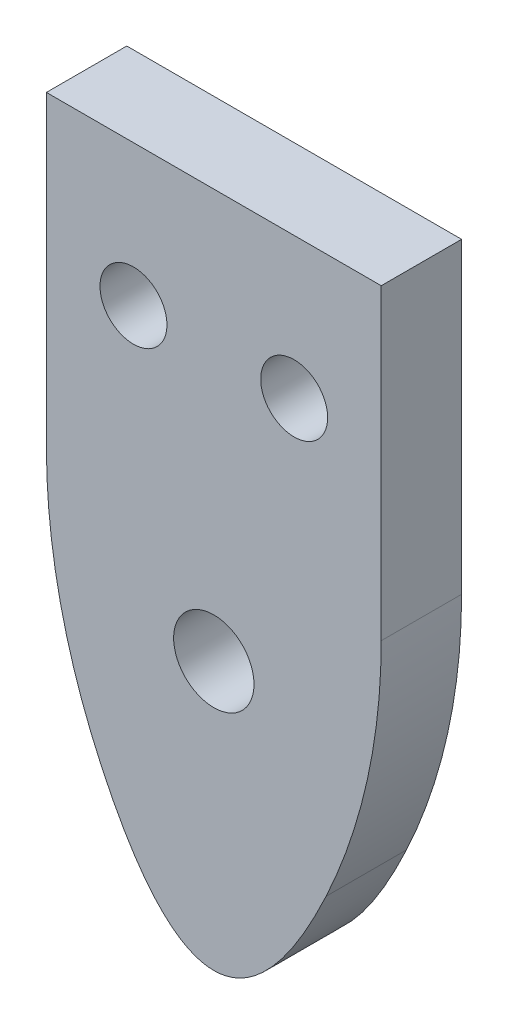
ISO-10303-21;
HEADER;
FILE_DESCRIPTION(('STEP AP214'),'2;1');
FILE_NAME('part.step','',(''),(''),'','','');
FILE_SCHEMA(('AUTOMOTIVE_DESIGN { 1 0 10303 214 1 1 1 1 }'));
ENDSEC;
DATA;
#1=APPLICATION_CONTEXT('core data for automotive mechanical design processes');
#2=APPLICATION_PROTOCOL_DEFINITION('international standard','automotive_design',2000,#1);
#3=PRODUCT_CONTEXT('',#1,'mechanical');
#4=PRODUCT('Part','Part','',(#3));
#5=PRODUCT_RELATED_PRODUCT_CATEGORY('part','',(#4));
#6=PRODUCT_DEFINITION_FORMATION('','',#4);
#7=PRODUCT_DEFINITION_CONTEXT('part definition',#1,'design');
#8=PRODUCT_DEFINITION('design','',#6,#7);
#9=PRODUCT_DEFINITION_SHAPE('','',#8);
#10=(LENGTH_UNIT() NAMED_UNIT(*) SI_UNIT(.MILLI.,.METRE.));
#11=(NAMED_UNIT(*) PLANE_ANGLE_UNIT() SI_UNIT($,.RADIAN.));
#12=(NAMED_UNIT(*) SI_UNIT($,.STERADIAN.) SOLID_ANGLE_UNIT());
#13=UNCERTAINTY_MEASURE_WITH_UNIT(LENGTH_MEASURE(1.E-05),#10,'distance_accuracy_value','');
#14=(GEOMETRIC_REPRESENTATION_CONTEXT(3) GLOBAL_UNCERTAINTY_ASSIGNED_CONTEXT((#13)) GLOBAL_UNIT_ASSIGNED_CONTEXT((#10,
#11,#12)) REPRESENTATION_CONTEXT('',''));
#15=CARTESIAN_POINT('',(0.,0.,0.));
#16=DIRECTION('',(0.,0.,1.));
#17=DIRECTION('',(1.,0.,0.));
#18=AXIS2_PLACEMENT_3D('',#15,#16,#17);
#19=CARTESIAN_POINT('',(13.7722054429021,-9.04331233526242,3.));
#20=DIRECTION('',(0.,0.,-1.));
#21=DIRECTION('',(-1.,0.,0.));
#22=AXIS2_PLACEMENT_3D('',#19,#20,#21);
#23=CYLINDRICAL_SURFACE('',#22,22.);
#24=DIRECTION('',(0.,0.,-1.));
#25=VECTOR('',#24,1.);
#26=CARTESIAN_POINT('',(-8.22779455709792,-9.04331233526242,3.));
#27=LINE('',#26,#25);
#28=CARTESIAN_POINT('',(-8.22779455709792,-9.04331233526311,0.));
#29=VERTEX_POINT('',#28);
#30=CARTESIAN_POINT('',(-8.22779455709792,-9.04331233526246,3.));
#31=VERTEX_POINT('',#30);
#32=EDGE_CURVE('E197',#29,#31,#27,.F.);
#33=ORIENTED_EDGE('',*,*,#32,.F.);
#34=CARTESIAN_POINT('',(13.7722054429021,-9.04331233526242,0.));
#35=DIRECTION('',(0.,0.,1.));
#36=DIRECTION('',(1.,0.,0.));
#37=AXIS2_PLACEMENT_3D('',#34,#35,#36);
#38=CIRCLE('',#37,22.);
#39=CARTESIAN_POINT('',(-6.16815659530464,-18.337502014048,0.));
#40=VERTEX_POINT('',#39);
#41=EDGE_CURVE('E45',#40,#29,#38,.F.);
#42=ORIENTED_EDGE('',*,*,#41,.F.);
#43=DIRECTION('',(0.,0.,-1.));
#44=VECTOR('',#43,1.);
#45=CARTESIAN_POINT('',(-6.16815659530665,-18.3375020140437,3.));
#46=LINE('',#45,#44);
#47=CARTESIAN_POINT('',(-6.16815659530667,-18.3375020140436,3.));
#48=VERTEX_POINT('',#47);
#49=EDGE_CURVE('E302',#48,#40,#46,.T.);
#50=ORIENTED_EDGE('',*,*,#49,.F.);
#51=CARTESIAN_POINT('',(13.7722054429021,-9.04331233526242,3.));
#52=DIRECTION('',(0.,0.,1.));
#53=DIRECTION('',(1.,0.,0.));
#54=AXIS2_PLACEMENT_3D('',#51,#52,#53);
#55=CIRCLE('',#54,22.);
#56=EDGE_CURVE('E12',#31,#48,#55,.T.);
#57=ORIENTED_EDGE('',*,*,#56,.F.);
#58=EDGE_LOOP('',(#33,#42,#50,#57));
#59=FACE_BOUND('',#58,.T.);
#60=ADVANCED_FACE('F37',(#59),#23,.T.);
#61=CARTESIAN_POINT('',(-17.7277945570979,-9.04331233526242,3.));
#62=DIRECTION('',(0.,0.,-1.));
#63=DIRECTION('',(-1.,0.,0.));
#64=AXIS2_PLACEMENT_3D('',#61,#62,#63);
#65=CYLINDRICAL_SURFACE('',#64,22.);
#66=DIRECTION('',(0.,0.,-1.));
#67=VECTOR('',#66,1.);
#68=CARTESIAN_POINT('',(4.27220544290208,-9.04331233526242,3.));
#69=LINE('',#68,#67);
#70=CARTESIAN_POINT('',(4.27220544290208,-9.04331233526232,3.));
#71=VERTEX_POINT('',#70);
#72=CARTESIAN_POINT('',(4.27220544290208,-9.04331233526232,0.));
#73=VERTEX_POINT('',#72);
#74=EDGE_CURVE('E106',#71,#73,#69,.T.);
#75=ORIENTED_EDGE('',*,*,#74,.F.);
#76=CARTESIAN_POINT('',(-17.7277945570979,-9.04331233526242,3.));
#77=DIRECTION('',(0.,0.,1.));
#78=DIRECTION('',(1.,0.,0.));
#79=AXIS2_PLACEMENT_3D('',#76,#77,#78);
#80=CIRCLE('',#79,22.);
#81=CARTESIAN_POINT('',(2.21256748111127,-18.3375020140427,3.));
#82=VERTEX_POINT('',#81);
#83=EDGE_CURVE('E92',#82,#71,#80,.T.);
#84=ORIENTED_EDGE('',*,*,#83,.F.);
#85=DIRECTION('',(0.,0.,-1.));
#86=VECTOR('',#85,1.);
#87=CARTESIAN_POINT('',(2.21256748111127,-18.3375020140427,0.));
#88=LINE('',#87,#86);
#89=CARTESIAN_POINT('',(2.2125674811113,-18.3375020140427,0.));
#90=VERTEX_POINT('',#89);
#91=EDGE_CURVE('E140',#90,#82,#88,.F.);
#92=ORIENTED_EDGE('',*,*,#91,.F.);
#93=CARTESIAN_POINT('',(-17.7277945570979,-9.04331233526242,0.));
#94=DIRECTION('',(0.,0.,1.));
#95=DIRECTION('',(1.,0.,0.));
#96=AXIS2_PLACEMENT_3D('',#93,#94,#95);
#97=CIRCLE('',#96,22.);
#98=EDGE_CURVE('E145',#73,#90,#97,.F.);
#99=ORIENTED_EDGE('',*,*,#98,.F.);
#100=EDGE_LOOP('',(#75,#84,#92,#99));
#101=FACE_BOUND('',#100,.T.);
#102=ADVANCED_FACE('F172',(#101),#65,.T.);
#103=CARTESIAN_POINT('',(-8.22779455709792,0.,3.));
#104=DIRECTION('',(1.,0.,0.));
#105=DIRECTION('',(0.,0.,-1.));
#106=AXIS2_PLACEMENT_3D('',#103,#104,#105);
#107=PLANE('',#106);
#108=DIRECTION('',(0.,-1.,0.));
#109=VECTOR('',#108,1.);
#110=CARTESIAN_POINT('',(-8.22779455709792,0.,0.));
#111=LINE('',#110,#109);
#112=CARTESIAN_POINT('',(-8.22779455709792,2.43411702554041,0.));
#113=VERTEX_POINT('',#112);
#114=EDGE_CURVE('E125',#113,#29,#111,.T.);
#115=ORIENTED_EDGE('',*,*,#114,.T.);
#116=ORIENTED_EDGE('',*,*,#32,.T.);
#117=DIRECTION('',(0.,-1.,0.));
#118=VECTOR('',#117,1.);
#119=CARTESIAN_POINT('',(-8.22779455709792,0.,3.));
#120=LINE('',#119,#118);
#121=CARTESIAN_POINT('',(-8.22779455709792,2.43411702554041,3.));
#122=VERTEX_POINT('',#121);
#123=EDGE_CURVE('E155',#122,#31,#120,.T.);
#124=ORIENTED_EDGE('',*,*,#123,.F.);
#125=DIRECTION('',(0.,0.,-1.));
#126=VECTOR('',#125,1.);
#127=CARTESIAN_POINT('',(-8.22779455709792,2.43411702554041,3.));
#128=LINE('',#127,#126);
#129=EDGE_CURVE('E107',#122,#113,#128,.T.);
#130=ORIENTED_EDGE('',*,*,#129,.T.);
#131=EDGE_LOOP('',(#115,#116,#124,#130));
#132=FACE_BOUND('',#131,.T.);
#133=ADVANCED_FACE('F167',(#132),#107,.F.);
#134=CARTESIAN_POINT('',(-8.22779455709792,-12.8326403209265,3.));
#135=CARTESIAN_POINT('',(-7.06199205618199,-16.5632083238574,3.));
#136=CARTESIAN_POINT('',(-5.89618955526607,-18.9020625643392,3.));
#137=CARTESIAN_POINT('',(-1.97779455709792,-26.7632180775138,3.));
#138=CARTESIAN_POINT('',(1.94060044107023,-18.9020625643392,3.));
#139=CARTESIAN_POINT('',(3.10640294198616,-16.5632083238574,3.));
#140=CARTESIAN_POINT('',(4.27220544290209,-12.8326403209265,3.));
#141=B_SPLINE_CURVE_WITH_KNOTS('',2,(#134,#135,#136,#137,#138,#139,#140),.UNSPECIFIED.,.F.,.F.,
(3,2,2,3),(0.,0.186528400146548,0.813471599853452,1.),.UNSPECIFIED.);
#142=DIRECTION('',(0.,0.,-1.));
#143=VECTOR('',#142,1.);
#144=SURFACE_OF_LINEAR_EXTRUSION('',#141,#143);
#145=EDGE_CURVE('E96',#48,#82,#141,.T.);
#146=ORIENTED_EDGE('',*,*,#145,.F.);
#147=ORIENTED_EDGE('',*,*,#49,.T.);
#148=CARTESIAN_POINT('',(-8.22779455709792,-12.8326403209265,0.));
#149=CARTESIAN_POINT('',(-1.97779455709792,-32.8326403209265,0.));
#150=CARTESIAN_POINT('',(4.27220544290209,-12.8326403209265,0.));
#151=B_SPLINE_CURVE_WITH_KNOTS('',2,(#148,#149,#150),.UNSPECIFIED.,.F.,.F.,(3,3),(0.,1.),.UNSPECIFIED.);
#152=EDGE_CURVE('E128',#40,#90,#151,.T.);
#153=ORIENTED_EDGE('',*,*,#152,.T.);
#154=ORIENTED_EDGE('',*,*,#91,.T.);
#155=EDGE_LOOP('',(#146,#147,#153,#154));
#156=FACE_BOUND('',#155,.T.);
#157=ADVANCED_FACE('F163',(#156),#144,.F.);
#158=CARTESIAN_POINT('',(4.27220544290208,0.,3.));
#159=DIRECTION('',(-1.,0.,0.));
#160=DIRECTION('',(0.,-1.,0.));
#161=AXIS2_PLACEMENT_3D('',#158,#159,#160);
#162=PLANE('',#161);
#163=DIRECTION('',(0.,1.,0.));
#164=VECTOR('',#163,1.);
#165=CARTESIAN_POINT('',(4.27220544290208,0.,3.));
#166=LINE('',#165,#164);
#167=CARTESIAN_POINT('',(4.27220544290208,2.43411702554041,3.));
#168=VERTEX_POINT('',#167);
#169=EDGE_CURVE('E86',#71,#168,#166,.T.);
#170=ORIENTED_EDGE('',*,*,#169,.F.);
#171=ORIENTED_EDGE('',*,*,#74,.T.);
#172=DIRECTION('',(0.,1.,0.));
#173=VECTOR('',#172,1.);
#174=CARTESIAN_POINT('',(4.27220544290208,0.,0.));
#175=LINE('',#174,#173);
#176=CARTESIAN_POINT('',(4.27220544290208,2.43411702554041,0.));
#177=VERTEX_POINT('',#176);
#178=EDGE_CURVE('E102',#73,#177,#175,.T.);
#179=ORIENTED_EDGE('',*,*,#178,.T.);
#180=DIRECTION('',(0.,0.,-1.));
#181=VECTOR('',#180,1.);
#182=CARTESIAN_POINT('',(4.27220544290208,2.43411702554041,3.));
#183=LINE('',#182,#181);
#184=EDGE_CURVE('E99',#168,#177,#183,.T.);
#185=ORIENTED_EDGE('',*,*,#184,.F.);
#186=EDGE_LOOP('',(#170,#171,#179,#185));
#187=FACE_BOUND('',#186,.T.);
#188=ADVANCED_FACE('F100',(#187),#162,.F.);
#189=CARTESIAN_POINT('',(-1.97779455709792,-12.8326403209265,3.));
#190=DIRECTION('',(0.,0.,-1.));
#191=DIRECTION('',(-1.,0.,0.));
#192=AXIS2_PLACEMENT_3D('',#189,#190,#191);
#193=CYLINDRICAL_SURFACE('',#192,1.5);
#194=CARTESIAN_POINT('',(-1.97779455709792,-12.8326403209265,3.));
#195=DIRECTION('',(0.,0.,1.));
#196=DIRECTION('',(1.,0.,0.));
#197=AXIS2_PLACEMENT_3D('',#194,#195,#196);
#198=CIRCLE('',#197,1.5);
#199=CARTESIAN_POINT('',(-0.477794557097921,-12.8326403209265,3.));
#200=VERTEX_POINT('',#199);
#201=EDGE_CURVE('E198',#200,#200,#198,.T.);
#202=ORIENTED_EDGE('',*,*,#201,.T.);
#203=EDGE_LOOP('',(#202));
#204=FACE_BOUND('',#203,.T.);
#205=CARTESIAN_POINT('',(-1.97779455709792,-12.8326403209265,0.));
#206=DIRECTION('',(0.,0.,1.));
#207=DIRECTION('',(1.,0.,0.));
#208=AXIS2_PLACEMENT_3D('',#205,#206,#207);
#209=CIRCLE('',#208,1.5);
#210=CARTESIAN_POINT('',(-0.477794557097921,-12.8326403209265,0.));
#211=VERTEX_POINT('',#210);
#212=EDGE_CURVE('E122',#211,#211,#209,.T.);
#213=ORIENTED_EDGE('',*,*,#212,.F.);
#214=EDGE_LOOP('',(#213));
#215=FACE_BOUND('',#214,.T.);
#216=ADVANCED_FACE('F174',(#204,#215),#193,.F.);
#217=CARTESIAN_POINT('',(-4.97779455709792,-2.83264032092646,3.));
#218=DIRECTION('',(0.,0.,-1.));
#219=DIRECTION('',(-1.,0.,0.));
#220=AXIS2_PLACEMENT_3D('',#217,#218,#219);
#221=CYLINDRICAL_SURFACE('',#220,1.25);
#222=CARTESIAN_POINT('',(-4.97779455709792,-2.83264032092646,3.));
#223=DIRECTION('',(0.,0.,1.));
#224=DIRECTION('',(1.,0.,0.));
#225=AXIS2_PLACEMENT_3D('',#222,#223,#224);
#226=CIRCLE('',#225,1.25);
#227=CARTESIAN_POINT('',(-3.72779455709792,-2.83264032092646,3.));
#228=VERTEX_POINT('',#227);
#229=EDGE_CURVE('E200',#228,#228,#226,.T.);
#230=ORIENTED_EDGE('',*,*,#229,.T.);
#231=EDGE_LOOP('',(#230));
#232=FACE_BOUND('',#231,.T.);
#233=CARTESIAN_POINT('',(-4.97779455709792,-2.83264032092646,0.));
#234=DIRECTION('',(0.,0.,1.));
#235=DIRECTION('',(1.,0.,0.));
#236=AXIS2_PLACEMENT_3D('',#233,#234,#235);
#237=CIRCLE('',#236,1.25);
#238=CARTESIAN_POINT('',(-3.72779455709792,-2.83264032092646,0.));
#239=VERTEX_POINT('',#238);
#240=EDGE_CURVE('E119',#239,#239,#237,.T.);
#241=ORIENTED_EDGE('',*,*,#240,.F.);
#242=EDGE_LOOP('',(#241));
#243=FACE_BOUND('',#242,.T.);
#244=ADVANCED_FACE('F177',(#232,#243),#221,.F.);
#245=CARTESIAN_POINT('',(1.02220544290208,-2.83264032092646,3.));
#246=DIRECTION('',(0.,0.,-1.));
#247=DIRECTION('',(-1.,0.,0.));
#248=AXIS2_PLACEMENT_3D('',#245,#246,#247);
#249=CYLINDRICAL_SURFACE('',#248,1.25);
#250=CARTESIAN_POINT('',(1.02220544290208,-2.83264032092646,3.));
#251=DIRECTION('',(0.,0.,1.));
#252=DIRECTION('',(1.,0.,0.));
#253=AXIS2_PLACEMENT_3D('',#250,#251,#252);
#254=CIRCLE('',#253,1.25);
#255=CARTESIAN_POINT('',(2.27220544290208,-2.83264032092646,3.));
#256=VERTEX_POINT('',#255);
#257=EDGE_CURVE('E137',#256,#256,#254,.T.);
#258=ORIENTED_EDGE('',*,*,#257,.T.);
#259=EDGE_LOOP('',(#258));
#260=FACE_BOUND('',#259,.T.);
#261=CARTESIAN_POINT('',(1.02220544290208,-2.83264032092646,0.));
#262=DIRECTION('',(0.,0.,1.));
#263=DIRECTION('',(1.,0.,0.));
#264=AXIS2_PLACEMENT_3D('',#261,#262,#263);
#265=CIRCLE('',#264,1.25);
#266=CARTESIAN_POINT('',(2.27220544290208,-2.83264032092646,0.));
#267=VERTEX_POINT('',#266);
#268=EDGE_CURVE('E116',#267,#267,#265,.T.);
#269=ORIENTED_EDGE('',*,*,#268,.F.);
#270=EDGE_LOOP('',(#269));
#271=FACE_BOUND('',#270,.T.);
#272=ADVANCED_FACE('F181',(#260,#271),#249,.F.);
#273=CARTESIAN_POINT('',(0.,2.43411702554041,3.));
#274=DIRECTION('',(0.,1.,0.));
#275=DIRECTION('',(-1.,0.,0.));
#276=AXIS2_PLACEMENT_3D('',#273,#274,#275);
#277=PLANE('',#276);
#278=DIRECTION('',(1.,0.,0.));
#279=VECTOR('',#278,1.);
#280=CARTESIAN_POINT('',(0.,2.43411702554041,0.));
#281=LINE('',#280,#279);
#282=EDGE_CURVE('E136',#113,#177,#281,.T.);
#283=ORIENTED_EDGE('',*,*,#282,.F.);
#284=ORIENTED_EDGE('',*,*,#129,.F.);
#285=DIRECTION('',(1.,0.,0.));
#286=VECTOR('',#285,1.);
#287=CARTESIAN_POINT('',(0.,2.43411702554041,3.));
#288=LINE('',#287,#286);
#289=EDGE_CURVE('E90',#122,#168,#288,.T.);
#290=ORIENTED_EDGE('',*,*,#289,.T.);
#291=ORIENTED_EDGE('',*,*,#184,.T.);
#292=EDGE_LOOP('',(#283,#284,#290,#291));
#293=FACE_BOUND('',#292,.T.);
#294=ADVANCED_FACE('F109',(#293),#277,.T.);
#295=CARTESIAN_POINT('',(0.,0.,3.));
#296=DIRECTION('',(0.,0.,1.));
#297=DIRECTION('',(1.,0.,0.));
#298=AXIS2_PLACEMENT_3D('',#295,#296,#297);
#299=PLANE('',#298);
#300=ORIENTED_EDGE('',*,*,#257,.F.);
#301=EDGE_LOOP('',(#300));
#302=FACE_BOUND('',#301,.T.);
#303=ORIENTED_EDGE('',*,*,#229,.F.);
#304=EDGE_LOOP('',(#303));
#305=FACE_BOUND('',#304,.T.);
#306=ORIENTED_EDGE('',*,*,#201,.F.);
#307=EDGE_LOOP('',(#306));
#308=FACE_BOUND('',#307,.T.);
#309=ORIENTED_EDGE('',*,*,#123,.T.);
#310=ORIENTED_EDGE('',*,*,#56,.T.);
#311=ORIENTED_EDGE('',*,*,#145,.T.);
#312=ORIENTED_EDGE('',*,*,#83,.T.);
#313=ORIENTED_EDGE('',*,*,#169,.T.);
#314=ORIENTED_EDGE('',*,*,#289,.F.);
#315=EDGE_LOOP('',(#309,#310,#311,#312,#313,#314));
#316=FACE_BOUND('',#315,.T.);
#317=ADVANCED_FACE('F88',(#302,#305,#308,#316),#299,.T.);
#318=CARTESIAN_POINT('',(0.,0.,0.));
#319=DIRECTION('',(0.,0.,1.));
#320=DIRECTION('',(1.,0.,0.));
#321=AXIS2_PLACEMENT_3D('',#318,#319,#320);
#322=PLANE('',#321);
#323=ORIENTED_EDGE('',*,*,#268,.T.);
#324=EDGE_LOOP('',(#323));
#325=FACE_BOUND('',#324,.T.);
#326=ORIENTED_EDGE('',*,*,#240,.T.);
#327=EDGE_LOOP('',(#326));
#328=FACE_BOUND('',#327,.T.);
#329=ORIENTED_EDGE('',*,*,#212,.T.);
#330=EDGE_LOOP('',(#329));
#331=FACE_BOUND('',#330,.T.);
#332=ORIENTED_EDGE('',*,*,#152,.F.);
#333=ORIENTED_EDGE('',*,*,#41,.T.);
#334=ORIENTED_EDGE('',*,*,#114,.F.);
#335=ORIENTED_EDGE('',*,*,#282,.T.);
#336=ORIENTED_EDGE('',*,*,#178,.F.);
#337=ORIENTED_EDGE('',*,*,#98,.T.);
#338=EDGE_LOOP('',(#332,#333,#334,#335,#336,#337));
#339=FACE_BOUND('',#338,.T.);
#340=ADVANCED_FACE('F194',(#325,#328,#331,#339),#322,.F.);
#341=CLOSED_SHELL('',(#60,#102,#133,#157,#188,#216,#244,#272,#294,#317,#340));
#342=MANIFOLD_SOLID_BREP('B2',#341);
#343=ADVANCED_BREP_SHAPE_REPRESENTATION('',(#18,#342),#14);
#344=SHAPE_DEFINITION_REPRESENTATION(#9,#343);
ENDSEC;
END-ISO-10303-21;
